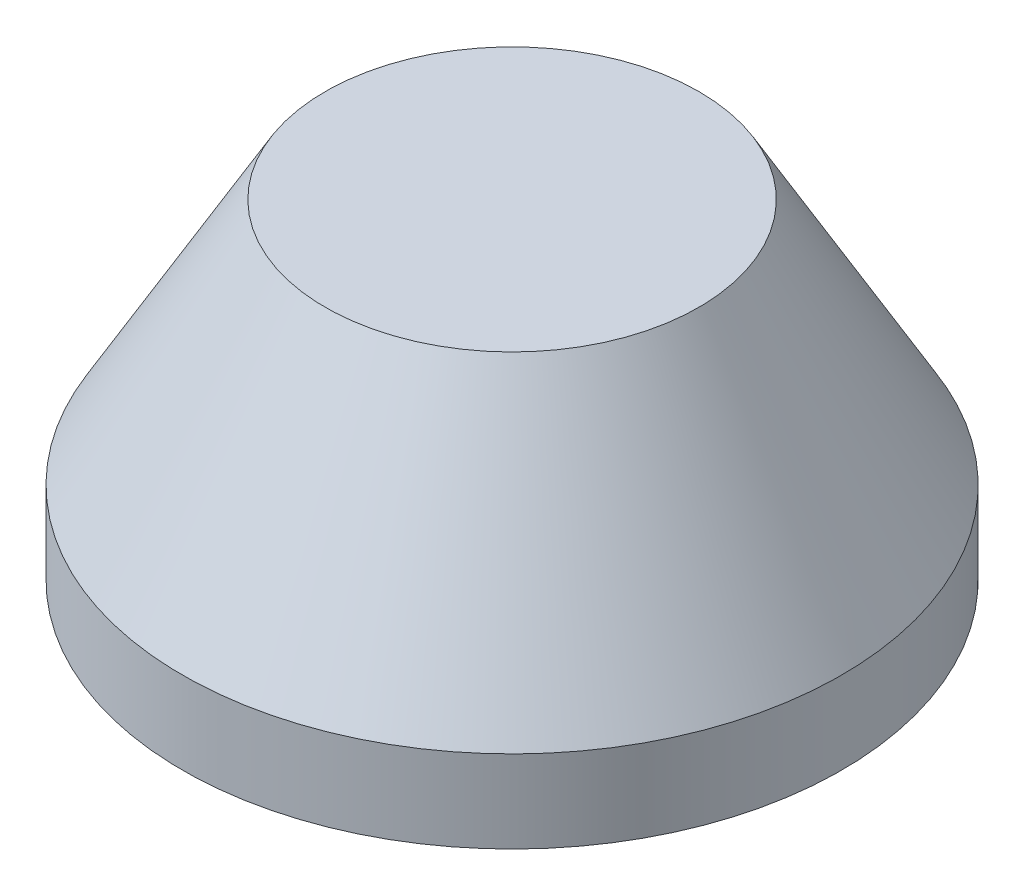
ISO-10303-21;
HEADER;
FILE_DESCRIPTION(('STEP AP214'),'2;1');
FILE_NAME('part.step','',(''),(''),'','','');
FILE_SCHEMA(('AUTOMOTIVE_DESIGN { 1 0 10303 214 1 1 1 1 }'));
ENDSEC;
DATA;
#1=APPLICATION_CONTEXT('core data for automotive mechanical design processes');
#2=APPLICATION_PROTOCOL_DEFINITION('international standard','automotive_design',2000,#1);
#3=PRODUCT_CONTEXT('',#1,'mechanical');
#4=PRODUCT('Part','Part','',(#3));
#5=PRODUCT_RELATED_PRODUCT_CATEGORY('part','',(#4));
#6=PRODUCT_DEFINITION_FORMATION('','',#4);
#7=PRODUCT_DEFINITION_CONTEXT('part definition',#1,'design');
#8=PRODUCT_DEFINITION('design','',#6,#7);
#9=PRODUCT_DEFINITION_SHAPE('','',#8);
#10=(LENGTH_UNIT() NAMED_UNIT(*) SI_UNIT(.MILLI.,.METRE.));
#11=(NAMED_UNIT(*) PLANE_ANGLE_UNIT() SI_UNIT($,.RADIAN.));
#12=(NAMED_UNIT(*) SI_UNIT($,.STERADIAN.) SOLID_ANGLE_UNIT());
#13=UNCERTAINTY_MEASURE_WITH_UNIT(LENGTH_MEASURE(1.E-05),#10,'distance_accuracy_value','');
#14=(GEOMETRIC_REPRESENTATION_CONTEXT(3) GLOBAL_UNCERTAINTY_ASSIGNED_CONTEXT((#13)) GLOBAL_UNIT_ASSIGNED_CONTEXT((#10,
#11,#12)) REPRESENTATION_CONTEXT('',''));
#15=CARTESIAN_POINT('',(0.,0.,0.));
#16=DIRECTION('',(0.,0.,1.));
#17=DIRECTION('',(1.,0.,0.));
#18=AXIS2_PLACEMENT_3D('',#15,#16,#17);
#19=CARTESIAN_POINT('',(0.,0.,0.));
#20=DIRECTION('',(0.,1.,0.));
#21=DIRECTION('',(0.,0.,1.));
#22=AXIS2_PLACEMENT_3D('',#19,#20,#21);
#23=PLANE('',#22);
#24=CARTESIAN_POINT('',(0.,0.,0.));
#25=DIRECTION('',(0.,-1.,0.));
#26=DIRECTION('',(0.,0.,-1.));
#27=AXIS2_PLACEMENT_3D('',#24,#25,#26);
#28=CIRCLE('',#27,9.525);
#29=CARTESIAN_POINT('',(0.,0.,-9.525));
#30=VERTEX_POINT('',#29);
#31=EDGE_CURVE('E70',#30,#30,#28,.T.);
#32=ORIENTED_EDGE('',*,*,#31,.F.);
#33=EDGE_LOOP('',(#32));
#34=FACE_BOUND('',#33,.T.);
#35=CARTESIAN_POINT('',(0.,0.,0.));
#36=DIRECTION('',(0.,-1.,0.));
#37=DIRECTION('',(0.,0.,-1.));
#38=AXIS2_PLACEMENT_3D('',#35,#36,#37);
#39=CIRCLE('',#38,25.4);
#40=CARTESIAN_POINT('',(0.,0.,-25.4));
#41=VERTEX_POINT('',#40);
#42=EDGE_CURVE('E13',#41,#41,#39,.T.);
#43=ORIENTED_EDGE('',*,*,#42,.T.);
#44=EDGE_LOOP('',(#43));
#45=FACE_BOUND('',#44,.T.);
#46=ADVANCED_FACE('F50',(#34,#45),#23,.F.);
#47=CARTESIAN_POINT('',(0.,0.,0.));
#48=DIRECTION('',(0.,-1.,0.));
#49=DIRECTION('',(0.,0.,-1.));
#50=AXIS2_PLACEMENT_3D('',#47,#48,#49);
#51=CYLINDRICAL_SURFACE('',#50,25.4);
#52=ORIENTED_EDGE('',*,*,#42,.F.);
#53=EDGE_LOOP('',(#52));
#54=FACE_BOUND('',#53,.T.);
#55=CARTESIAN_POINT('',(0.,6.35,0.));
#56=DIRECTION('',(0.,-1.,0.));
#57=DIRECTION('',(0.,0.,-1.));
#58=AXIS2_PLACEMENT_3D('',#55,#56,#57);
#59=CIRCLE('',#58,25.4);
#60=CARTESIAN_POINT('',(0.,6.35,-25.4));
#61=VERTEX_POINT('',#60);
#62=EDGE_CURVE('E56',#61,#61,#59,.T.);
#63=ORIENTED_EDGE('',*,*,#62,.T.);
#64=EDGE_LOOP('',(#63));
#65=FACE_BOUND('',#64,.T.);
#66=ADVANCED_FACE('F79',(#54,#65),#51,.T.);
#67=CARTESIAN_POINT('',(0.,25.4,0.));
#68=DIRECTION('',(0.,-1.,0.));
#69=DIRECTION('',(0.,0.,-1.));
#70=AXIS2_PLACEMENT_3D('',#67,#68,#69);
#71=CONICAL_SURFACE('',#70,14.4014773719376,0.5235987755983);
#72=ORIENTED_EDGE('',*,*,#62,.F.);
#73=EDGE_LOOP('',(#72));
#74=FACE_BOUND('',#73,.T.);
#75=CARTESIAN_POINT('',(0.,25.4,0.));
#76=DIRECTION('',(0.,-1.,0.));
#77=DIRECTION('',(0.,0.,-1.));
#78=AXIS2_PLACEMENT_3D('',#75,#76,#77);
#79=CIRCLE('',#78,14.4014773719376);
#80=CARTESIAN_POINT('',(0.,25.4,-14.4014773719376));
#81=VERTEX_POINT('',#80);
#82=EDGE_CURVE('E69',#81,#81,#79,.T.);
#83=ORIENTED_EDGE('',*,*,#82,.T.);
#84=EDGE_LOOP('',(#83));
#85=FACE_BOUND('',#84,.T.);
#86=ADVANCED_FACE('F81',(#74,#85),#71,.T.);
#87=CARTESIAN_POINT('',(-14.4014773719376,25.4,0.));
#88=DIRECTION('',(0.,-1.,0.));
#89=DIRECTION('',(0.,0.,-1.));
#90=AXIS2_PLACEMENT_3D('',#87,#88,#89);
#91=PLANE('',#90);
#92=ORIENTED_EDGE('',*,*,#82,.F.);
#93=EDGE_LOOP('',(#92));
#94=FACE_BOUND('',#93,.T.);
#95=ADVANCED_FACE('F63',(#94),#91,.F.);
#96=CARTESIAN_POINT('',(0.,13.3268026037625,0.));
#97=DIRECTION('',(0.,-1.,0.));
#98=DIRECTION('',(0.,0.,-1.));
#99=AXIS2_PLACEMENT_3D('',#96,#97,#98);
#100=CONICAL_SURFACE('',#99,9.525,1.02974425867665);
#101=CARTESIAN_POINT('',(0.,19.05,0.));
#102=VERTEX_POINT('',#101);
#103=VERTEX_LOOP('',#102);
#104=FACE_BOUND('',#103,.T.);
#105=CARTESIAN_POINT('',(0.,13.3268026037625,0.));
#106=DIRECTION('',(0.,-1.,0.));
#107=DIRECTION('',(0.,0.,-1.));
#108=AXIS2_PLACEMENT_3D('',#105,#106,#107);
#109=CIRCLE('',#108,9.525);
#110=CARTESIAN_POINT('',(0.,13.3268026037625,-9.525));
#111=VERTEX_POINT('',#110);
#112=EDGE_CURVE('E67',#111,#111,#109,.T.);
#113=ORIENTED_EDGE('',*,*,#112,.T.);
#114=EDGE_LOOP('',(#113));
#115=FACE_BOUND('',#114,.T.);
#116=ADVANCED_FACE('F59',(#104,#115),#100,.F.);
#117=CARTESIAN_POINT('',(0.,0.,0.));
#118=DIRECTION('',(0.,-1.,0.));
#119=DIRECTION('',(0.,0.,-1.));
#120=AXIS2_PLACEMENT_3D('',#117,#118,#119);
#121=CYLINDRICAL_SURFACE('',#120,9.525);
#122=ORIENTED_EDGE('',*,*,#112,.F.);
#123=EDGE_LOOP('',(#122));
#124=FACE_BOUND('',#123,.T.);
#125=ORIENTED_EDGE('',*,*,#31,.T.);
#126=EDGE_LOOP('',(#125));
#127=FACE_BOUND('',#126,.T.);
#128=ADVANCED_FACE('F62',(#124,#127),#121,.F.);
#129=CLOSED_SHELL('',(#46,#66,#86,#95,#116,#128));
#130=MANIFOLD_SOLID_BREP('B2',#129);
#131=ADVANCED_BREP_SHAPE_REPRESENTATION('',(#18,#130),#14);
#132=SHAPE_DEFINITION_REPRESENTATION(#9,#131);
ENDSEC;
END-ISO-10303-21;
